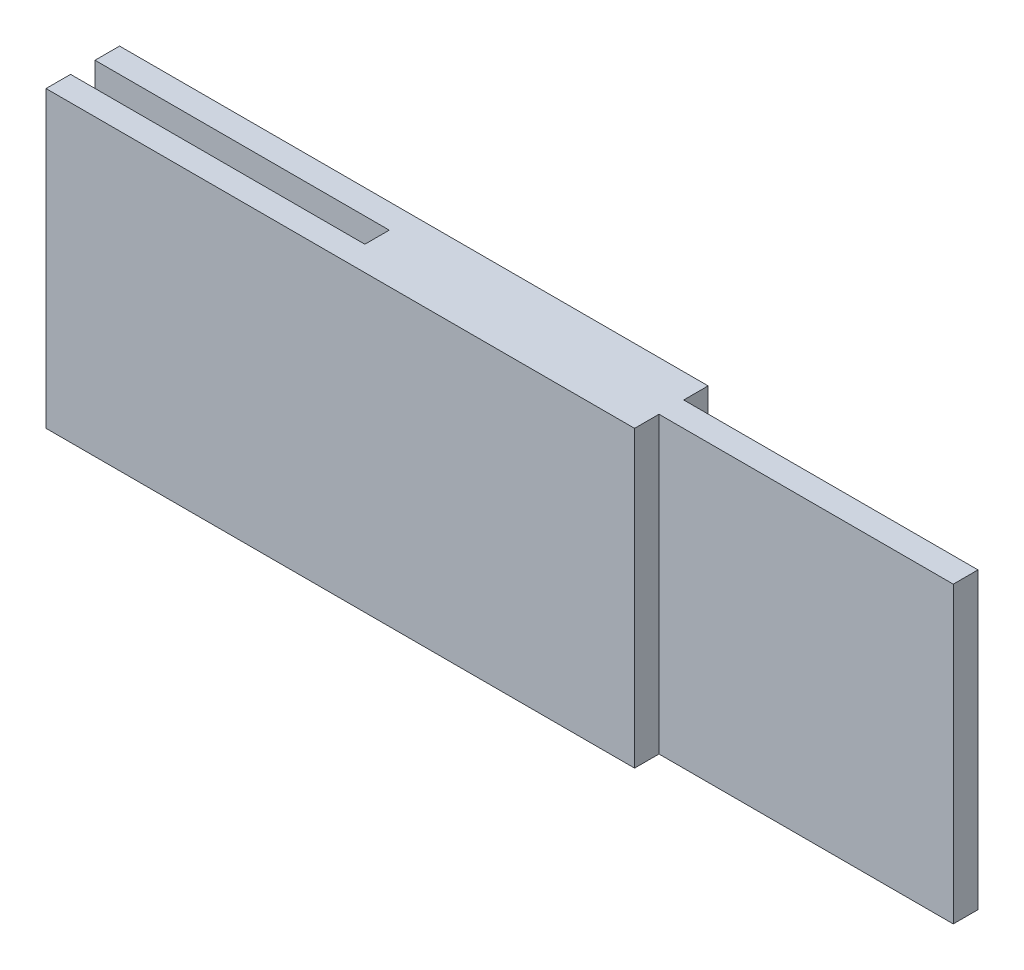
ISO-10303-21;
HEADER;
FILE_DESCRIPTION(('STEP AP214'),'2;1');
FILE_NAME('part.step','',(''),(''),'','','');
FILE_SCHEMA(('AUTOMOTIVE_DESIGN { 1 0 10303 214 1 1 1 1 }'));
ENDSEC;
DATA;
#1=APPLICATION_CONTEXT('core data for automotive mechanical design processes');
#2=APPLICATION_PROTOCOL_DEFINITION('international standard','automotive_design',2000,#1);
#3=PRODUCT_CONTEXT('',#1,'mechanical');
#4=PRODUCT('Part','Part','',(#3));
#5=PRODUCT_RELATED_PRODUCT_CATEGORY('part','',(#4));
#6=PRODUCT_DEFINITION_FORMATION('','',#4);
#7=PRODUCT_DEFINITION_CONTEXT('part definition',#1,'design');
#8=PRODUCT_DEFINITION('design','',#6,#7);
#9=PRODUCT_DEFINITION_SHAPE('','',#8);
#10=(LENGTH_UNIT() NAMED_UNIT(*) SI_UNIT(.MILLI.,.METRE.));
#11=(NAMED_UNIT(*) PLANE_ANGLE_UNIT() SI_UNIT($,.RADIAN.));
#12=(NAMED_UNIT(*) SI_UNIT($,.STERADIAN.) SOLID_ANGLE_UNIT());
#13=UNCERTAINTY_MEASURE_WITH_UNIT(LENGTH_MEASURE(1.E-05),#10,'distance_accuracy_value','');
#14=(GEOMETRIC_REPRESENTATION_CONTEXT(3) GLOBAL_UNCERTAINTY_ASSIGNED_CONTEXT((#13)) GLOBAL_UNIT_ASSIGNED_CONTEXT((#10,
#11,#12)) REPRESENTATION_CONTEXT('',''));
#15=CARTESIAN_POINT('',(0.,0.,0.));
#16=DIRECTION('',(0.,0.,1.));
#17=DIRECTION('',(1.,0.,0.));
#18=AXIS2_PLACEMENT_3D('',#15,#16,#17);
#19=CARTESIAN_POINT('',(-30.,-10.,2.5));
#20=DIRECTION('',(1.,0.,0.));
#21=DIRECTION('',(0.,0.,-1.));
#22=AXIS2_PLACEMENT_3D('',#19,#20,#21);
#23=PLANE('',#22);
#24=DIRECTION('',(0.,0.,-1.));
#25=VECTOR('',#24,1.);
#26=CARTESIAN_POINT('',(-30.,-10.,2.5));
#27=LINE('',#26,#25);
#28=CARTESIAN_POINT('',(-30.,-10.,-0.83));
#29=VERTEX_POINT('',#28);
#30=CARTESIAN_POINT('',(-30.,-10.,-2.5));
#31=VERTEX_POINT('',#30);
#32=EDGE_CURVE('E41',#29,#31,#27,.T.);
#33=ORIENTED_EDGE('',*,*,#32,.F.);
#34=DIRECTION('',(0.,1.,0.));
#35=VECTOR('',#34,1.);
#36=CARTESIAN_POINT('',(-30.,-10.,-0.83));
#37=LINE('',#36,#35);
#38=CARTESIAN_POINT('',(-30.,10.,-0.83));
#39=VERTEX_POINT('',#38);
#40=EDGE_CURVE('E161',#29,#39,#37,.T.);
#41=ORIENTED_EDGE('',*,*,#40,.T.);
#42=DIRECTION('',(0.,0.,-1.));
#43=VECTOR('',#42,1.);
#44=CARTESIAN_POINT('',(-30.,10.,2.5));
#45=LINE('',#44,#43);
#46=CARTESIAN_POINT('',(-30.,10.,-2.5));
#47=VERTEX_POINT('',#46);
#48=EDGE_CURVE('E151',#39,#47,#45,.T.);
#49=ORIENTED_EDGE('',*,*,#48,.T.);
#50=DIRECTION('',(0.,-1.,0.));
#51=VECTOR('',#50,1.);
#52=CARTESIAN_POINT('',(-30.,-10.,-2.5));
#53=LINE('',#52,#51);
#54=EDGE_CURVE('E158',#47,#31,#53,.T.);
#55=ORIENTED_EDGE('',*,*,#54,.T.);
#56=EDGE_LOOP('',(#33,#41,#49,#55));
#57=FACE_BOUND('',#56,.T.);
#58=ADVANCED_FACE('F33',(#57),#23,.F.);
#59=CARTESIAN_POINT('',(-30.,10.,2.5));
#60=VERTEX_POINT('',#59);
#61=CARTESIAN_POINT('',(-30.,10.,0.83));
#62=VERTEX_POINT('',#61);
#63=EDGE_CURVE('E146',#60,#62,#45,.T.);
#64=ORIENTED_EDGE('',*,*,#63,.T.);
#65=DIRECTION('',(0.,1.,0.));
#66=VECTOR('',#65,1.);
#67=CARTESIAN_POINT('',(-30.,-10.,0.83));
#68=LINE('',#67,#66);
#69=CARTESIAN_POINT('',(-30.,-10.,0.83));
#70=VERTEX_POINT('',#69);
#71=EDGE_CURVE('E169',#70,#62,#68,.T.);
#72=ORIENTED_EDGE('',*,*,#71,.F.);
#73=CARTESIAN_POINT('',(-30.,-10.,2.5));
#74=VERTEX_POINT('',#73);
#75=EDGE_CURVE('E11',#74,#70,#27,.T.);
#76=ORIENTED_EDGE('',*,*,#75,.F.);
#77=DIRECTION('',(0.,-1.,0.));
#78=VECTOR('',#77,1.);
#79=CARTESIAN_POINT('',(-30.,-10.,2.5));
#80=LINE('',#79,#78);
#81=EDGE_CURVE('E154',#60,#74,#80,.T.);
#82=ORIENTED_EDGE('',*,*,#81,.F.);
#83=EDGE_LOOP('',(#64,#72,#76,#82));
#84=FACE_BOUND('',#83,.T.);
#85=ADVANCED_FACE('F35',(#84),#23,.F.);
#86=CARTESIAN_POINT('',(30.,-10.,2.5));
#87=DIRECTION('',(0.,1.,0.));
#88=DIRECTION('',(-1.,0.,0.));
#89=AXIS2_PLACEMENT_3D('',#86,#87,#88);
#90=PLANE('',#89);
#91=DIRECTION('',(-1.,0.,0.));
#92=VECTOR('',#91,1.);
#93=CARTESIAN_POINT('',(30.,-10.,0.84));
#94=LINE('',#93,#92);
#95=CARTESIAN_POINT('',(30.,-10.,0.84));
#96=VERTEX_POINT('',#95);
#97=CARTESIAN_POINT('',(10.,-10.,0.840000000000003));
#98=VERTEX_POINT('',#97);
#99=EDGE_CURVE('E121',#96,#98,#94,.T.);
#100=ORIENTED_EDGE('',*,*,#99,.T.);
#101=DIRECTION('',(0.,0.,1.));
#102=VECTOR('',#101,1.);
#103=CARTESIAN_POINT('',(10.,-10.,2.5));
#104=LINE('',#103,#102);
#105=CARTESIAN_POINT('',(10.,-10.,2.5));
#106=VERTEX_POINT('',#105);
#107=EDGE_CURVE('E132',#98,#106,#104,.T.);
#108=ORIENTED_EDGE('',*,*,#107,.T.);
#109=DIRECTION('',(1.,0.,0.));
#110=VECTOR('',#109,1.);
#111=CARTESIAN_POINT('',(30.,-10.,2.5));
#112=LINE('',#111,#110);
#113=EDGE_CURVE('E164',#74,#106,#112,.T.);
#114=ORIENTED_EDGE('',*,*,#113,.F.);
#115=ORIENTED_EDGE('',*,*,#75,.T.);
#116=DIRECTION('',(1.,0.,0.));
#117=VECTOR('',#116,1.);
#118=CARTESIAN_POINT('',(-30.,-10.,0.83));
#119=LINE('',#118,#117);
#120=CARTESIAN_POINT('',(-9.99999999999999,-10.,0.83));
#121=VERTEX_POINT('',#120);
#122=EDGE_CURVE('E180',#70,#121,#119,.T.);
#123=ORIENTED_EDGE('',*,*,#122,.T.);
#124=DIRECTION('',(0.,0.,-1.));
#125=VECTOR('',#124,1.);
#126=CARTESIAN_POINT('',(-9.99999999999999,-10.,-0.83));
#127=LINE('',#126,#125);
#128=CARTESIAN_POINT('',(-9.99999999999999,-10.,-0.83));
#129=VERTEX_POINT('',#128);
#130=EDGE_CURVE('E190',#121,#129,#127,.T.);
#131=ORIENTED_EDGE('',*,*,#130,.T.);
#132=DIRECTION('',(-1.,0.,0.));
#133=VECTOR('',#132,1.);
#134=CARTESIAN_POINT('',(-30.,-10.,-0.83));
#135=LINE('',#134,#133);
#136=EDGE_CURVE('E172',#129,#29,#135,.T.);
#137=ORIENTED_EDGE('',*,*,#136,.T.);
#138=ORIENTED_EDGE('',*,*,#32,.T.);
#139=DIRECTION('',(1.,0.,0.));
#140=VECTOR('',#139,1.);
#141=CARTESIAN_POINT('',(30.,-10.,-2.5));
#142=LINE('',#141,#140);
#143=CARTESIAN_POINT('',(10.,-10.,-2.5));
#144=VERTEX_POINT('',#143);
#145=EDGE_CURVE('E155',#31,#144,#142,.T.);
#146=ORIENTED_EDGE('',*,*,#145,.T.);
#147=DIRECTION('',(0.,0.,1.));
#148=VECTOR('',#147,1.);
#149=CARTESIAN_POINT('',(10.,-10.,-2.5));
#150=LINE('',#149,#148);
#151=CARTESIAN_POINT('',(10.,-10.,-0.839999999999998));
#152=VERTEX_POINT('',#151);
#153=EDGE_CURVE('E56',#144,#152,#150,.T.);
#154=ORIENTED_EDGE('',*,*,#153,.T.);
#155=DIRECTION('',(1.,0.,0.));
#156=VECTOR('',#155,1.);
#157=CARTESIAN_POINT('',(30.,-10.,-0.840000000000001));
#158=LINE('',#157,#156);
#159=CARTESIAN_POINT('',(30.,-10.,-0.840000000000001));
#160=VERTEX_POINT('',#159);
#161=EDGE_CURVE('E145',#152,#160,#158,.T.);
#162=ORIENTED_EDGE('',*,*,#161,.T.);
#163=DIRECTION('',(0.,0.,-1.));
#164=VECTOR('',#163,1.);
#165=CARTESIAN_POINT('',(30.,-10.,2.5));
#166=LINE('',#165,#164);
#167=EDGE_CURVE('E138',#96,#160,#166,.T.);
#168=ORIENTED_EDGE('',*,*,#167,.F.);
#169=EDGE_LOOP('',(#100,#108,#114,#115,#123,#131,#137,#138,#146,#154,#162,#168));
#170=FACE_BOUND('',#169,.T.);
#171=ADVANCED_FACE('F143',(#170),#90,.F.);
#172=CARTESIAN_POINT('',(30.,-10.,2.5));
#173=DIRECTION('',(-1.,0.,0.));
#174=DIRECTION('',(0.,0.,1.));
#175=AXIS2_PLACEMENT_3D('',#172,#173,#174);
#176=PLANE('',#175);
#177=DIRECTION('',(0.,0.,-1.));
#178=VECTOR('',#177,1.);
#179=CARTESIAN_POINT('',(30.,10.,2.5));
#180=LINE('',#179,#178);
#181=CARTESIAN_POINT('',(30.,10.,0.84));
#182=VERTEX_POINT('',#181);
#183=CARTESIAN_POINT('',(30.,10.,-0.840000000000001));
#184=VERTEX_POINT('',#183);
#185=EDGE_CURVE('E140',#182,#184,#180,.T.);
#186=ORIENTED_EDGE('',*,*,#185,.F.);
#187=DIRECTION('',(0.,1.,0.));
#188=VECTOR('',#187,1.);
#189=CARTESIAN_POINT('',(30.,-10.,0.84));
#190=LINE('',#189,#188);
#191=EDGE_CURVE('E125',#96,#182,#190,.T.);
#192=ORIENTED_EDGE('',*,*,#191,.F.);
#193=ORIENTED_EDGE('',*,*,#167,.T.);
#194=DIRECTION('',(0.,1.,0.));
#195=VECTOR('',#194,1.);
#196=CARTESIAN_POINT('',(30.,-10.,-0.840000000000001));
#197=LINE('',#196,#195);
#198=EDGE_CURVE('E187',#160,#184,#197,.T.);
#199=ORIENTED_EDGE('',*,*,#198,.T.);
#200=EDGE_LOOP('',(#186,#192,#193,#199));
#201=FACE_BOUND('',#200,.T.);
#202=ADVANCED_FACE('F136',(#201),#176,.F.);
#203=CARTESIAN_POINT('',(30.,10.,2.5));
#204=DIRECTION('',(0.,-1.,0.));
#205=DIRECTION('',(1.,0.,0.));
#206=AXIS2_PLACEMENT_3D('',#203,#204,#205);
#207=PLANE('',#206);
#208=DIRECTION('',(-1.,0.,0.));
#209=VECTOR('',#208,1.);
#210=CARTESIAN_POINT('',(30.,10.,2.5));
#211=LINE('',#210,#209);
#212=CARTESIAN_POINT('',(10.,10.,2.5));
#213=VERTEX_POINT('',#212);
#214=EDGE_CURVE('E162',#213,#60,#211,.T.);
#215=ORIENTED_EDGE('',*,*,#214,.F.);
#216=DIRECTION('',(0.,0.,1.));
#217=VECTOR('',#216,1.);
#218=CARTESIAN_POINT('',(10.,10.,2.5));
#219=LINE('',#218,#217);
#220=CARTESIAN_POINT('',(10.,10.,0.840000000000003));
#221=VERTEX_POINT('',#220);
#222=EDGE_CURVE('E48',#221,#213,#219,.T.);
#223=ORIENTED_EDGE('',*,*,#222,.F.);
#224=DIRECTION('',(-1.,0.,0.));
#225=VECTOR('',#224,1.);
#226=CARTESIAN_POINT('',(30.,10.,0.84));
#227=LINE('',#226,#225);
#228=EDGE_CURVE('E212',#182,#221,#227,.T.);
#229=ORIENTED_EDGE('',*,*,#228,.F.);
#230=ORIENTED_EDGE('',*,*,#185,.T.);
#231=DIRECTION('',(1.,0.,0.));
#232=VECTOR('',#231,1.);
#233=CARTESIAN_POINT('',(30.,10.,-0.840000000000001));
#234=LINE('',#233,#232);
#235=CARTESIAN_POINT('',(10.,10.,-0.839999999999998));
#236=VERTEX_POINT('',#235);
#237=EDGE_CURVE('E200',#236,#184,#234,.T.);
#238=ORIENTED_EDGE('',*,*,#237,.F.);
#239=DIRECTION('',(0.,0.,1.));
#240=VECTOR('',#239,1.);
#241=CARTESIAN_POINT('',(10.,10.,-2.5));
#242=LINE('',#241,#240);
#243=CARTESIAN_POINT('',(10.,10.,-2.5));
#244=VERTEX_POINT('',#243);
#245=EDGE_CURVE('E203',#244,#236,#242,.T.);
#246=ORIENTED_EDGE('',*,*,#245,.F.);
#247=DIRECTION('',(-1.,0.,0.));
#248=VECTOR('',#247,1.);
#249=CARTESIAN_POINT('',(30.,10.,-2.5));
#250=LINE('',#249,#248);
#251=EDGE_CURVE('E152',#244,#47,#250,.T.);
#252=ORIENTED_EDGE('',*,*,#251,.T.);
#253=ORIENTED_EDGE('',*,*,#48,.F.);
#254=DIRECTION('',(-1.,0.,0.));
#255=VECTOR('',#254,1.);
#256=CARTESIAN_POINT('',(-30.,10.,-0.83));
#257=LINE('',#256,#255);
#258=CARTESIAN_POINT('',(-9.99999999999999,10.,-0.83));
#259=VERTEX_POINT('',#258);
#260=EDGE_CURVE('E178',#259,#39,#257,.T.);
#261=ORIENTED_EDGE('',*,*,#260,.F.);
#262=DIRECTION('',(0.,0.,-1.));
#263=VECTOR('',#262,1.);
#264=CARTESIAN_POINT('',(-9.99999999999999,10.,-0.83));
#265=LINE('',#264,#263);
#266=CARTESIAN_POINT('',(-9.99999999999999,10.,0.83));
#267=VERTEX_POINT('',#266);
#268=EDGE_CURVE('E181',#267,#259,#265,.T.);
#269=ORIENTED_EDGE('',*,*,#268,.F.);
#270=DIRECTION('',(1.,0.,0.));
#271=VECTOR('',#270,1.);
#272=CARTESIAN_POINT('',(-30.,10.,0.83));
#273=LINE('',#272,#271);
#274=EDGE_CURVE('E184',#62,#267,#273,.T.);
#275=ORIENTED_EDGE('',*,*,#274,.F.);
#276=ORIENTED_EDGE('',*,*,#63,.F.);
#277=EDGE_LOOP('',(#215,#223,#229,#230,#238,#246,#252,#253,#261,#269,#275,#276));
#278=FACE_BOUND('',#277,.T.);
#279=ADVANCED_FACE('F246',(#278),#207,.F.);
#280=CARTESIAN_POINT('',(0.,0.,2.5));
#281=DIRECTION('',(0.,0.,1.));
#282=DIRECTION('',(1.,0.,0.));
#283=AXIS2_PLACEMENT_3D('',#280,#281,#282);
#284=PLANE('',#283);
#285=DIRECTION('',(0.,1.,0.));
#286=VECTOR('',#285,1.);
#287=CARTESIAN_POINT('',(10.,-10.,2.5));
#288=LINE('',#287,#286);
#289=EDGE_CURVE('E206',#106,#213,#288,.T.);
#290=ORIENTED_EDGE('',*,*,#289,.T.);
#291=ORIENTED_EDGE('',*,*,#214,.T.);
#292=ORIENTED_EDGE('',*,*,#81,.T.);
#293=ORIENTED_EDGE('',*,*,#113,.T.);
#294=EDGE_LOOP('',(#290,#291,#292,#293));
#295=FACE_BOUND('',#294,.T.);
#296=ADVANCED_FACE('F215',(#295),#284,.T.);
#297=CARTESIAN_POINT('',(0.,0.,-2.5));
#298=DIRECTION('',(0.,0.,1.));
#299=DIRECTION('',(1.,0.,0.));
#300=AXIS2_PLACEMENT_3D('',#297,#298,#299);
#301=PLANE('',#300);
#302=ORIENTED_EDGE('',*,*,#251,.F.);
#303=DIRECTION('',(0.,1.,0.));
#304=VECTOR('',#303,1.);
#305=CARTESIAN_POINT('',(10.,-10.,-2.5));
#306=LINE('',#305,#304);
#307=EDGE_CURVE('E195',#144,#244,#306,.T.);
#308=ORIENTED_EDGE('',*,*,#307,.F.);
#309=ORIENTED_EDGE('',*,*,#145,.F.);
#310=ORIENTED_EDGE('',*,*,#54,.F.);
#311=EDGE_LOOP('',(#302,#308,#309,#310));
#312=FACE_BOUND('',#311,.T.);
#313=ADVANCED_FACE('F241',(#312),#301,.F.);
#314=CARTESIAN_POINT('',(-30.,-10.,-0.83));
#315=DIRECTION('',(0.,0.,-1.));
#316=DIRECTION('',(-1.,0.,0.));
#317=AXIS2_PLACEMENT_3D('',#314,#315,#316);
#318=PLANE('',#317);
#319=ORIENTED_EDGE('',*,*,#260,.T.);
#320=ORIENTED_EDGE('',*,*,#40,.F.);
#321=ORIENTED_EDGE('',*,*,#136,.F.);
#322=DIRECTION('',(0.,1.,0.));
#323=VECTOR('',#322,1.);
#324=CARTESIAN_POINT('',(-9.99999999999999,-10.,-0.83));
#325=LINE('',#324,#323);
#326=EDGE_CURVE('E174',#129,#259,#325,.T.);
#327=ORIENTED_EDGE('',*,*,#326,.T.);
#328=EDGE_LOOP('',(#319,#320,#321,#327));
#329=FACE_BOUND('',#328,.T.);
#330=ADVANCED_FACE('F232',(#329),#318,.F.);
#331=CARTESIAN_POINT('',(-9.99999999999999,-10.,-0.83));
#332=DIRECTION('',(1.,0.,0.));
#333=DIRECTION('',(0.,1.,0.));
#334=AXIS2_PLACEMENT_3D('',#331,#332,#333);
#335=PLANE('',#334);
#336=ORIENTED_EDGE('',*,*,#268,.T.);
#337=ORIENTED_EDGE('',*,*,#326,.F.);
#338=ORIENTED_EDGE('',*,*,#130,.F.);
#339=DIRECTION('',(0.,1.,0.));
#340=VECTOR('',#339,1.);
#341=CARTESIAN_POINT('',(-9.99999999999999,-10.,0.83));
#342=LINE('',#341,#340);
#343=EDGE_CURVE('E171',#121,#267,#342,.T.);
#344=ORIENTED_EDGE('',*,*,#343,.T.);
#345=EDGE_LOOP('',(#336,#337,#338,#344));
#346=FACE_BOUND('',#345,.T.);
#347=ADVANCED_FACE('F228',(#346),#335,.F.);
#348=CARTESIAN_POINT('',(-30.,-10.,0.83));
#349=DIRECTION('',(0.,0.,1.));
#350=DIRECTION('',(1.,0.,0.));
#351=AXIS2_PLACEMENT_3D('',#348,#349,#350);
#352=PLANE('',#351);
#353=ORIENTED_EDGE('',*,*,#274,.T.);
#354=ORIENTED_EDGE('',*,*,#343,.F.);
#355=ORIENTED_EDGE('',*,*,#122,.F.);
#356=ORIENTED_EDGE('',*,*,#71,.T.);
#357=EDGE_LOOP('',(#353,#354,#355,#356));
#358=FACE_BOUND('',#357,.T.);
#359=ADVANCED_FACE('F224',(#358),#352,.F.);
#360=CARTESIAN_POINT('',(30.,-10.,-0.840000000000001));
#361=DIRECTION('',(0.,0.,1.));
#362=DIRECTION('',(1.,0.,0.));
#363=AXIS2_PLACEMENT_3D('',#360,#361,#362);
#364=PLANE('',#363);
#365=ORIENTED_EDGE('',*,*,#237,.T.);
#366=ORIENTED_EDGE('',*,*,#198,.F.);
#367=ORIENTED_EDGE('',*,*,#161,.F.);
#368=DIRECTION('',(0.,1.,0.));
#369=VECTOR('',#368,1.);
#370=CARTESIAN_POINT('',(10.,-10.,-0.839999999999998));
#371=LINE('',#370,#369);
#372=EDGE_CURVE('E197',#152,#236,#371,.T.);
#373=ORIENTED_EDGE('',*,*,#372,.T.);
#374=EDGE_LOOP('',(#365,#366,#367,#373));
#375=FACE_BOUND('',#374,.T.);
#376=ADVANCED_FACE('F248',(#375),#364,.F.);
#377=CARTESIAN_POINT('',(10.,-10.,-2.5));
#378=DIRECTION('',(-1.,0.,0.));
#379=DIRECTION('',(0.,-1.,0.));
#380=AXIS2_PLACEMENT_3D('',#377,#378,#379);
#381=PLANE('',#380);
#382=ORIENTED_EDGE('',*,*,#245,.T.);
#383=ORIENTED_EDGE('',*,*,#372,.F.);
#384=ORIENTED_EDGE('',*,*,#153,.F.);
#385=ORIENTED_EDGE('',*,*,#307,.T.);
#386=EDGE_LOOP('',(#382,#383,#384,#385));
#387=FACE_BOUND('',#386,.T.);
#388=ADVANCED_FACE('F243',(#387),#381,.F.);
#389=CARTESIAN_POINT('',(10.,-10.,2.5));
#390=DIRECTION('',(-1.,0.,0.));
#391=DIRECTION('',(0.,0.,1.));
#392=AXIS2_PLACEMENT_3D('',#389,#390,#391);
#393=PLANE('',#392);
#394=ORIENTED_EDGE('',*,*,#222,.T.);
#395=ORIENTED_EDGE('',*,*,#289,.F.);
#396=ORIENTED_EDGE('',*,*,#107,.F.);
#397=DIRECTION('',(0.,1.,0.));
#398=VECTOR('',#397,1.);
#399=CARTESIAN_POINT('',(10.,-10.,0.840000000000003));
#400=LINE('',#399,#398);
#401=EDGE_CURVE('E127',#98,#221,#400,.T.);
#402=ORIENTED_EDGE('',*,*,#401,.T.);
#403=EDGE_LOOP('',(#394,#395,#396,#402));
#404=FACE_BOUND('',#403,.T.);
#405=ADVANCED_FACE('F255',(#404),#393,.F.);
#406=CARTESIAN_POINT('',(30.,-10.,0.84));
#407=DIRECTION('',(0.,0.,-1.));
#408=DIRECTION('',(-1.,0.,0.));
#409=AXIS2_PLACEMENT_3D('',#406,#407,#408);
#410=PLANE('',#409);
#411=ORIENTED_EDGE('',*,*,#228,.T.);
#412=ORIENTED_EDGE('',*,*,#401,.F.);
#413=ORIENTED_EDGE('',*,*,#99,.F.);
#414=ORIENTED_EDGE('',*,*,#191,.T.);
#415=EDGE_LOOP('',(#411,#412,#413,#414));
#416=FACE_BOUND('',#415,.T.);
#417=ADVANCED_FACE('F124',(#416),#410,.F.);
#418=CLOSED_SHELL('',(#58,#85,#171,#202,#279,#296,#313,#330,#347,#359,#376,#388,#405,#417));
#419=MANIFOLD_SOLID_BREP('B2',#418);
#420=ADVANCED_BREP_SHAPE_REPRESENTATION('',(#18,#419),#14);
#421=SHAPE_DEFINITION_REPRESENTATION(#9,#420);
ENDSEC;
END-ISO-10303-21;
